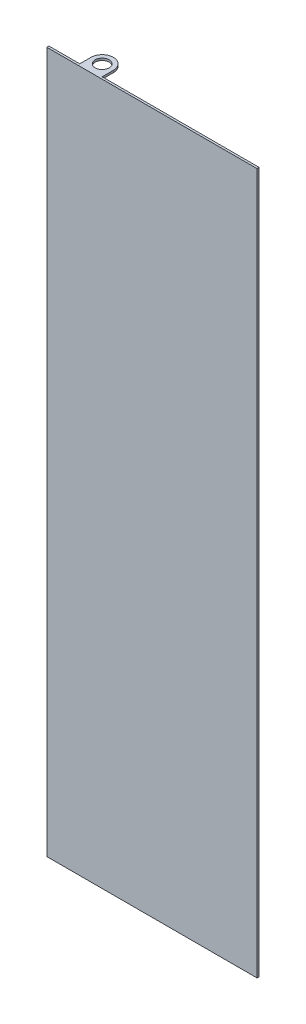
ISO-10303-21;
HEADER;
FILE_DESCRIPTION(('STEP AP214'),'2;1');
FILE_NAME('part.step','',(''),(''),'','','');
FILE_SCHEMA(('AUTOMOTIVE_DESIGN { 1 0 10303 214 1 1 1 1 }'));
ENDSEC;
DATA;
#1=APPLICATION_CONTEXT('core data for automotive mechanical design processes');
#2=APPLICATION_PROTOCOL_DEFINITION('international standard','automotive_design',2000,#1);
#3=PRODUCT_CONTEXT('',#1,'mechanical');
#4=PRODUCT('Part','Part','',(#3));
#5=PRODUCT_RELATED_PRODUCT_CATEGORY('part','',(#4));
#6=PRODUCT_DEFINITION_FORMATION('','',#4);
#7=PRODUCT_DEFINITION_CONTEXT('part definition',#1,'design');
#8=PRODUCT_DEFINITION('design','',#6,#7);
#9=PRODUCT_DEFINITION_SHAPE('','',#8);
#10=(LENGTH_UNIT() NAMED_UNIT(*) SI_UNIT(.MILLI.,.METRE.));
#11=(NAMED_UNIT(*) PLANE_ANGLE_UNIT() SI_UNIT($,.RADIAN.));
#12=(NAMED_UNIT(*) SI_UNIT($,.STERADIAN.) SOLID_ANGLE_UNIT());
#13=UNCERTAINTY_MEASURE_WITH_UNIT(LENGTH_MEASURE(1.E-05),#10,'distance_accuracy_value','');
#14=(GEOMETRIC_REPRESENTATION_CONTEXT(3) GLOBAL_UNCERTAINTY_ASSIGNED_CONTEXT((#13)) GLOBAL_UNIT_ASSIGNED_CONTEXT((#10,
#11,#12)) REPRESENTATION_CONTEXT('',''));
#15=CARTESIAN_POINT('',(0.,0.,0.));
#16=DIRECTION('',(0.,0.,1.));
#17=DIRECTION('',(1.,0.,0.));
#18=AXIS2_PLACEMENT_3D('',#15,#16,#17);
#19=CARTESIAN_POINT('',(0.,0.,0.));
#20=DIRECTION('',(0.,0.,1.));
#21=DIRECTION('',(1.,0.,0.));
#22=AXIS2_PLACEMENT_3D('',#19,#20,#21);
#23=PLANE('',#22);
#24=DIRECTION('',(0.,1.,0.));
#25=VECTOR('',#24,1.);
#26=CARTESIAN_POINT('',(-53.,248.5,0.));
#27=LINE('',#26,#25);
#28=CARTESIAN_POINT('',(-53.,248.5,0.));
#29=VERTEX_POINT('',#28);
#30=CARTESIAN_POINT('',(-53.,250.,0.));
#31=VERTEX_POINT('',#30);
#32=EDGE_CURVE('E139',#29,#31,#27,.T.);
#33=ORIENTED_EDGE('',*,*,#32,.F.);
#34=DIRECTION('',(1.,0.,0.));
#35=VECTOR('',#34,1.);
#36=CARTESIAN_POINT('',(-37.,248.5,0.));
#37=LINE('',#36,#35);
#38=CARTESIAN_POINT('',(-37.,248.5,0.));
#39=VERTEX_POINT('',#38);
#40=EDGE_CURVE('E131',#29,#39,#37,.T.);
#41=ORIENTED_EDGE('',*,*,#40,.T.);
#42=DIRECTION('',(0.,1.,0.));
#43=VECTOR('',#42,1.);
#44=CARTESIAN_POINT('',(-37.,248.5,0.));
#45=LINE('',#44,#43);
#46=CARTESIAN_POINT('',(-37.,250.,0.));
#47=VERTEX_POINT('',#46);
#48=EDGE_CURVE('E116',#39,#47,#45,.T.);
#49=ORIENTED_EDGE('',*,*,#48,.T.);
#50=DIRECTION('',(-1.,0.,0.));
#51=VECTOR('',#50,1.);
#52=CARTESIAN_POINT('',(-75.,250.,0.));
#53=LINE('',#52,#51);
#54=CARTESIAN_POINT('',(75.,250.,0.));
#55=VERTEX_POINT('',#54);
#56=EDGE_CURVE('E184',#55,#47,#53,.T.);
#57=ORIENTED_EDGE('',*,*,#56,.F.);
#58=DIRECTION('',(0.,1.,0.));
#59=VECTOR('',#58,1.);
#60=CARTESIAN_POINT('',(75.,250.,0.));
#61=LINE('',#60,#59);
#62=CARTESIAN_POINT('',(75.,-250.,0.));
#63=VERTEX_POINT('',#62);
#64=EDGE_CURVE('E163',#63,#55,#61,.T.);
#65=ORIENTED_EDGE('',*,*,#64,.F.);
#66=DIRECTION('',(1.,0.,0.));
#67=VECTOR('',#66,1.);
#68=CARTESIAN_POINT('',(-75.,-250.,0.));
#69=LINE('',#68,#67);
#70=CARTESIAN_POINT('',(-75.,-250.,0.));
#71=VERTEX_POINT('',#70);
#72=EDGE_CURVE('E89',#71,#63,#69,.T.);
#73=ORIENTED_EDGE('',*,*,#72,.F.);
#74=DIRECTION('',(0.,-1.,0.));
#75=VECTOR('',#74,1.);
#76=CARTESIAN_POINT('',(-75.,250.,0.));
#77=LINE('',#76,#75);
#78=CARTESIAN_POINT('',(-75.,250.,0.));
#79=VERTEX_POINT('',#78);
#80=EDGE_CURVE('E187',#79,#71,#77,.T.);
#81=ORIENTED_EDGE('',*,*,#80,.F.);
#82=EDGE_CURVE('E183',#31,#79,#53,.T.);
#83=ORIENTED_EDGE('',*,*,#82,.F.);
#84=EDGE_LOOP('',(#33,#41,#49,#57,#65,#73,#81,#83));
#85=FACE_BOUND('',#84,.T.);
#86=ADVANCED_FACE('F43',(#85),#23,.F.);
#87=CARTESIAN_POINT('',(75.,250.,1.5));
#88=DIRECTION('',(-1.,0.,0.));
#89=DIRECTION('',(0.,-1.,0.));
#90=AXIS2_PLACEMENT_3D('',#87,#88,#89);
#91=PLANE('',#90);
#92=ORIENTED_EDGE('',*,*,#64,.T.);
#93=DIRECTION('',(0.,0.,-1.));
#94=VECTOR('',#93,1.);
#95=CARTESIAN_POINT('',(75.,250.,1.5));
#96=LINE('',#95,#94);
#97=CARTESIAN_POINT('',(75.,250.,1.5));
#98=VERTEX_POINT('',#97);
#99=EDGE_CURVE('E11',#98,#55,#96,.T.);
#100=ORIENTED_EDGE('',*,*,#99,.F.);
#101=DIRECTION('',(0.,1.,0.));
#102=VECTOR('',#101,1.);
#103=CARTESIAN_POINT('',(75.,250.,1.5));
#104=LINE('',#103,#102);
#105=CARTESIAN_POINT('',(75.,-250.,1.5));
#106=VERTEX_POINT('',#105);
#107=EDGE_CURVE('E169',#106,#98,#104,.T.);
#108=ORIENTED_EDGE('',*,*,#107,.F.);
#109=DIRECTION('',(0.,0.,-1.));
#110=VECTOR('',#109,1.);
#111=CARTESIAN_POINT('',(75.,-250.,1.5));
#112=LINE('',#111,#110);
#113=EDGE_CURVE('E179',#106,#63,#112,.T.);
#114=ORIENTED_EDGE('',*,*,#113,.T.);
#115=EDGE_LOOP('',(#92,#100,#108,#114));
#116=FACE_BOUND('',#115,.T.);
#117=ADVANCED_FACE('F45',(#116),#91,.F.);
#118=CARTESIAN_POINT('',(-75.,250.,1.5));
#119=DIRECTION('',(0.,-1.,0.));
#120=DIRECTION('',(0.,0.,-1.));
#121=AXIS2_PLACEMENT_3D('',#118,#119,#120);
#122=PLANE('',#121);
#123=ORIENTED_EDGE('',*,*,#56,.T.);
#124=DIRECTION('',(0.,0.,-1.));
#125=VECTOR('',#124,1.);
#126=CARTESIAN_POINT('',(-37.,250.,0.));
#127=LINE('',#126,#125);
#128=CARTESIAN_POINT('',(-37.,250.,-8.));
#129=VERTEX_POINT('',#128);
#130=EDGE_CURVE('E59',#47,#129,#127,.T.);
#131=ORIENTED_EDGE('',*,*,#130,.T.);
#132=CARTESIAN_POINT('',(-45.,250.,-8.));
#133=DIRECTION('',(0.,1.,0.));
#134=DIRECTION('',(0.,0.,1.));
#135=AXIS2_PLACEMENT_3D('',#132,#133,#134);
#136=CIRCLE('',#135,8.);
#137=CARTESIAN_POINT('',(-53.,250.,-8.));
#138=VERTEX_POINT('',#137);
#139=EDGE_CURVE('E145',#129,#138,#136,.T.);
#140=ORIENTED_EDGE('',*,*,#139,.T.);
#141=DIRECTION('',(0.,0.,1.));
#142=VECTOR('',#141,1.);
#143=CARTESIAN_POINT('',(-53.,250.,0.));
#144=LINE('',#143,#142);
#145=EDGE_CURVE('E141',#138,#31,#144,.T.);
#146=ORIENTED_EDGE('',*,*,#145,.T.);
#147=ORIENTED_EDGE('',*,*,#82,.T.);
#148=DIRECTION('',(0.,0.,-1.));
#149=VECTOR('',#148,1.);
#150=CARTESIAN_POINT('',(-75.,250.,1.5));
#151=LINE('',#150,#149);
#152=CARTESIAN_POINT('',(-75.,250.,1.5));
#153=VERTEX_POINT('',#152);
#154=EDGE_CURVE('E52',#153,#79,#151,.T.);
#155=ORIENTED_EDGE('',*,*,#154,.F.);
#156=DIRECTION('',(-1.,0.,0.));
#157=VECTOR('',#156,1.);
#158=CARTESIAN_POINT('',(-75.,250.,1.5));
#159=LINE('',#158,#157);
#160=EDGE_CURVE('E96',#98,#153,#159,.T.);
#161=ORIENTED_EDGE('',*,*,#160,.F.);
#162=ORIENTED_EDGE('',*,*,#99,.T.);
#163=EDGE_LOOP('',(#123,#131,#140,#146,#147,#155,#161,#162));
#164=FACE_BOUND('',#163,.T.);
#165=CARTESIAN_POINT('',(-45.,250.,-8.));
#166=DIRECTION('',(0.,1.,0.));
#167=DIRECTION('',(0.,0.,1.));
#168=AXIS2_PLACEMENT_3D('',#165,#166,#167);
#169=CIRCLE('',#168,5.);
#170=CARTESIAN_POINT('',(-45.,250.,-3.));
#171=VERTEX_POINT('',#170);
#172=EDGE_CURVE('E148',#171,#171,#169,.T.);
#173=ORIENTED_EDGE('',*,*,#172,.F.);
#174=EDGE_LOOP('',(#173));
#175=FACE_BOUND('',#174,.T.);
#176=ADVANCED_FACE('F217',(#164,#175),#122,.F.);
#177=CARTESIAN_POINT('',(-75.,250.,1.5));
#178=DIRECTION('',(1.,0.,0.));
#179=DIRECTION('',(0.,1.,0.));
#180=AXIS2_PLACEMENT_3D('',#177,#178,#179);
#181=PLANE('',#180);
#182=ORIENTED_EDGE('',*,*,#80,.T.);
#183=DIRECTION('',(0.,0.,-1.));
#184=VECTOR('',#183,1.);
#185=CARTESIAN_POINT('',(-75.,-250.,1.5));
#186=LINE('',#185,#184);
#187=CARTESIAN_POINT('',(-75.,-250.,1.5));
#188=VERTEX_POINT('',#187);
#189=EDGE_CURVE('E194',#188,#71,#186,.T.);
#190=ORIENTED_EDGE('',*,*,#189,.F.);
#191=DIRECTION('',(0.,-1.,0.));
#192=VECTOR('',#191,1.);
#193=CARTESIAN_POINT('',(-75.,250.,1.5));
#194=LINE('',#193,#192);
#195=EDGE_CURVE('E174',#153,#188,#194,.T.);
#196=ORIENTED_EDGE('',*,*,#195,.F.);
#197=ORIENTED_EDGE('',*,*,#154,.T.);
#198=EDGE_LOOP('',(#182,#190,#196,#197));
#199=FACE_BOUND('',#198,.T.);
#200=ADVANCED_FACE('F201',(#199),#181,.F.);
#201=CARTESIAN_POINT('',(-75.,-250.,1.5));
#202=DIRECTION('',(0.,1.,0.));
#203=DIRECTION('',(0.,0.,1.));
#204=AXIS2_PLACEMENT_3D('',#201,#202,#203);
#205=PLANE('',#204);
#206=ORIENTED_EDGE('',*,*,#72,.T.);
#207=ORIENTED_EDGE('',*,*,#113,.F.);
#208=DIRECTION('',(1.,0.,0.));
#209=VECTOR('',#208,1.);
#210=CARTESIAN_POINT('',(-75.,-250.,1.5));
#211=LINE('',#210,#209);
#212=EDGE_CURVE('E68',#188,#106,#211,.T.);
#213=ORIENTED_EDGE('',*,*,#212,.F.);
#214=ORIENTED_EDGE('',*,*,#189,.T.);
#215=EDGE_LOOP('',(#206,#207,#213,#214));
#216=FACE_BOUND('',#215,.T.);
#217=ADVANCED_FACE('F207',(#216),#205,.F.);
#218=CARTESIAN_POINT('',(0.,0.,1.5));
#219=DIRECTION('',(0.,0.,1.));
#220=DIRECTION('',(1.,0.,0.));
#221=AXIS2_PLACEMENT_3D('',#218,#219,#220);
#222=PLANE('',#221);
#223=ORIENTED_EDGE('',*,*,#107,.T.);
#224=ORIENTED_EDGE('',*,*,#160,.T.);
#225=ORIENTED_EDGE('',*,*,#195,.T.);
#226=ORIENTED_EDGE('',*,*,#212,.T.);
#227=EDGE_LOOP('',(#223,#224,#225,#226));
#228=FACE_BOUND('',#227,.T.);
#229=ADVANCED_FACE('F209',(#228),#222,.T.);
#230=CARTESIAN_POINT('',(-53.,248.5,0.));
#231=DIRECTION('',(-1.,0.,0.));
#232=DIRECTION('',(0.,0.,1.));
#233=AXIS2_PLACEMENT_3D('',#230,#231,#232);
#234=PLANE('',#233);
#235=ORIENTED_EDGE('',*,*,#145,.F.);
#236=DIRECTION('',(0.,1.,0.));
#237=VECTOR('',#236,1.);
#238=CARTESIAN_POINT('',(-53.,248.5,-8.));
#239=LINE('',#238,#237);
#240=CARTESIAN_POINT('',(-53.,248.5,-8.));
#241=VERTEX_POINT('',#240);
#242=EDGE_CURVE('E164',#241,#138,#239,.T.);
#243=ORIENTED_EDGE('',*,*,#242,.F.);
#244=DIRECTION('',(0.,0.,1.));
#245=VECTOR('',#244,1.);
#246=CARTESIAN_POINT('',(-53.,248.5,0.));
#247=LINE('',#246,#245);
#248=EDGE_CURVE('E125',#241,#29,#247,.T.);
#249=ORIENTED_EDGE('',*,*,#248,.T.);
#250=ORIENTED_EDGE('',*,*,#32,.T.);
#251=EDGE_LOOP('',(#235,#243,#249,#250));
#252=FACE_BOUND('',#251,.T.);
#253=ADVANCED_FACE('F215',(#252),#234,.T.);
#254=CARTESIAN_POINT('',(-45.,248.5,-8.));
#255=DIRECTION('',(0.,1.,0.));
#256=DIRECTION('',(0.,0.,1.));
#257=AXIS2_PLACEMENT_3D('',#254,#255,#256);
#258=CYLINDRICAL_SURFACE('',#257,8.);
#259=ORIENTED_EDGE('',*,*,#139,.F.);
#260=DIRECTION('',(0.,1.,0.));
#261=VECTOR('',#260,1.);
#262=CARTESIAN_POINT('',(-37.,248.5,-8.));
#263=LINE('',#262,#261);
#264=CARTESIAN_POINT('',(-37.,248.5,-8.));
#265=VERTEX_POINT('',#264);
#266=EDGE_CURVE('E124',#265,#129,#263,.T.);
#267=ORIENTED_EDGE('',*,*,#266,.F.);
#268=CARTESIAN_POINT('',(-45.,248.5,-8.));
#269=DIRECTION('',(0.,1.,0.));
#270=DIRECTION('',(0.,0.,1.));
#271=AXIS2_PLACEMENT_3D('',#268,#269,#270);
#272=CIRCLE('',#271,8.);
#273=EDGE_CURVE('E134',#265,#241,#272,.T.);
#274=ORIENTED_EDGE('',*,*,#273,.T.);
#275=ORIENTED_EDGE('',*,*,#242,.T.);
#276=EDGE_LOOP('',(#259,#267,#274,#275));
#277=FACE_BOUND('',#276,.T.);
#278=ADVANCED_FACE('F227',(#277),#258,.T.);
#279=CARTESIAN_POINT('',(-37.,248.5,0.));
#280=DIRECTION('',(1.,0.,0.));
#281=DIRECTION('',(0.,0.,-1.));
#282=AXIS2_PLACEMENT_3D('',#279,#280,#281);
#283=PLANE('',#282);
#284=ORIENTED_EDGE('',*,*,#130,.F.);
#285=ORIENTED_EDGE('',*,*,#48,.F.);
#286=DIRECTION('',(0.,0.,-1.));
#287=VECTOR('',#286,1.);
#288=CARTESIAN_POINT('',(-37.,248.5,0.));
#289=LINE('',#288,#287);
#290=EDGE_CURVE('E119',#39,#265,#289,.T.);
#291=ORIENTED_EDGE('',*,*,#290,.T.);
#292=ORIENTED_EDGE('',*,*,#266,.T.);
#293=EDGE_LOOP('',(#284,#285,#291,#292));
#294=FACE_BOUND('',#293,.T.);
#295=ADVANCED_FACE('F118',(#294),#283,.T.);
#296=CARTESIAN_POINT('',(-45.,248.5,-8.));
#297=DIRECTION('',(0.,1.,0.));
#298=DIRECTION('',(0.,0.,1.));
#299=AXIS2_PLACEMENT_3D('',#296,#297,#298);
#300=PLANE('',#299);
#301=CARTESIAN_POINT('',(-45.,248.5,-8.));
#302=DIRECTION('',(0.,1.,0.));
#303=DIRECTION('',(0.,0.,1.));
#304=AXIS2_PLACEMENT_3D('',#301,#302,#303);
#305=CIRCLE('',#304,5.);
#306=CARTESIAN_POINT('',(-45.,248.5,-3.));
#307=VERTEX_POINT('',#306);
#308=EDGE_CURVE('E157',#307,#307,#305,.T.);
#309=ORIENTED_EDGE('',*,*,#308,.T.);
#310=EDGE_LOOP('',(#309));
#311=FACE_BOUND('',#310,.T.);
#312=ORIENTED_EDGE('',*,*,#40,.F.);
#313=ORIENTED_EDGE('',*,*,#248,.F.);
#314=ORIENTED_EDGE('',*,*,#273,.F.);
#315=ORIENTED_EDGE('',*,*,#290,.F.);
#316=EDGE_LOOP('',(#312,#313,#314,#315));
#317=FACE_BOUND('',#316,.T.);
#318=ADVANCED_FACE('F129',(#311,#317),#300,.F.);
#319=CARTESIAN_POINT('',(-45.,248.5,-8.));
#320=DIRECTION('',(0.,1.,0.));
#321=DIRECTION('',(0.,0.,1.));
#322=AXIS2_PLACEMENT_3D('',#319,#320,#321);
#323=CYLINDRICAL_SURFACE('',#322,5.);
#324=ORIENTED_EDGE('',*,*,#308,.F.);
#325=EDGE_LOOP('',(#324));
#326=FACE_BOUND('',#325,.T.);
#327=ORIENTED_EDGE('',*,*,#172,.T.);
#328=EDGE_LOOP('',(#327));
#329=FACE_BOUND('',#328,.T.);
#330=ADVANCED_FACE('F236',(#326,#329),#323,.F.);
#331=CLOSED_SHELL('',(#86,#117,#176,#200,#217,#229,#253,#278,#295,#318,#330));
#332=MANIFOLD_SOLID_BREP('B2',#331);
#333=ADVANCED_BREP_SHAPE_REPRESENTATION('',(#18,#332),#14);
#334=SHAPE_DEFINITION_REPRESENTATION(#9,#333);
ENDSEC;
END-ISO-10303-21;
